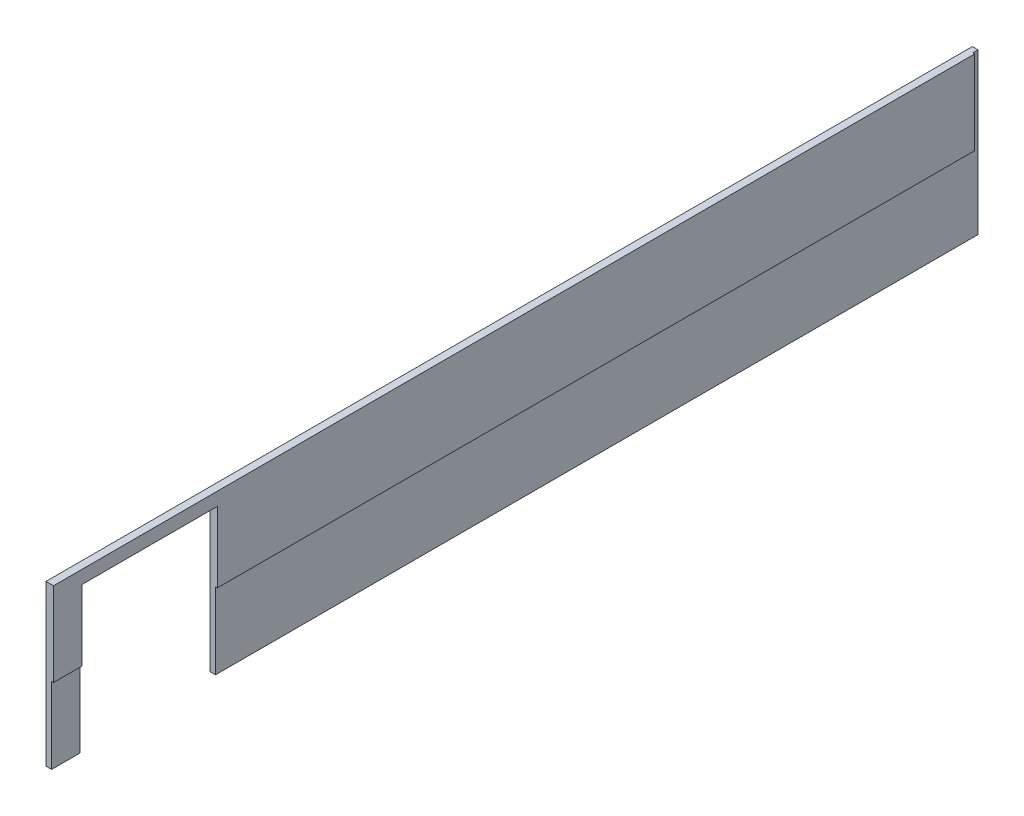
ISO-10303-21;
HEADER;
FILE_DESCRIPTION(('STEP AP214'),'2;1');
FILE_NAME('part.step','',(''),(''),'','','');
FILE_SCHEMA(('AUTOMOTIVE_DESIGN { 1 0 10303 214 1 1 1 1 }'));
ENDSEC;
DATA;
#1=APPLICATION_CONTEXT('core data for automotive mechanical design processes');
#2=APPLICATION_PROTOCOL_DEFINITION('international standard','automotive_design',2000,#1);
#3=PRODUCT_CONTEXT('',#1,'mechanical');
#4=PRODUCT('Part','Part','',(#3));
#5=PRODUCT_RELATED_PRODUCT_CATEGORY('part','',(#4));
#6=PRODUCT_DEFINITION_FORMATION('','',#4);
#7=PRODUCT_DEFINITION_CONTEXT('part definition',#1,'design');
#8=PRODUCT_DEFINITION('design','',#6,#7);
#9=PRODUCT_DEFINITION_SHAPE('','',#8);
#10=(LENGTH_UNIT() NAMED_UNIT(*) SI_UNIT(.MILLI.,.METRE.));
#11=(NAMED_UNIT(*) PLANE_ANGLE_UNIT() SI_UNIT($,.RADIAN.));
#12=(NAMED_UNIT(*) SI_UNIT($,.STERADIAN.) SOLID_ANGLE_UNIT());
#13=UNCERTAINTY_MEASURE_WITH_UNIT(LENGTH_MEASURE(1.E-05),#10,'distance_accuracy_value','');
#14=(GEOMETRIC_REPRESENTATION_CONTEXT(3) GLOBAL_UNCERTAINTY_ASSIGNED_CONTEXT((#13)) GLOBAL_UNIT_ASSIGNED_CONTEXT((#10,
#11,#12)) REPRESENTATION_CONTEXT('',''));
#15=CARTESIAN_POINT('',(0.,0.,0.));
#16=DIRECTION('',(0.,0.,1.));
#17=DIRECTION('',(1.,0.,0.));
#18=AXIS2_PLACEMENT_3D('',#15,#16,#17);
#19=CARTESIAN_POINT('',(76.2,0.,0.));
#20=DIRECTION('',(-1.,0.,0.));
#21=DIRECTION('',(0.,0.,1.));
#22=AXIS2_PLACEMENT_3D('',#19,#20,#21);
#23=PLANE('',#22);
#24=DIRECTION('',(0.,0.,-1.));
#25=VECTOR('',#24,1.);
#26=CARTESIAN_POINT('',(76.2,0.,0.));
#27=LINE('',#26,#25);
#28=CARTESIAN_POINT('',(76.2,0.,0.));
#29=VERTEX_POINT('',#28);
#30=CARTESIAN_POINT('',(76.2,0.,-381.));
#31=VERTEX_POINT('',#30);
#32=EDGE_CURVE('E185',#29,#31,#27,.T.);
#33=ORIENTED_EDGE('',*,*,#32,.T.);
#34=DIRECTION('',(0.,1.,0.));
#35=VECTOR('',#34,1.);
#36=CARTESIAN_POINT('',(76.2,0.,-381.));
#37=LINE('',#36,#35);
#38=CARTESIAN_POINT('',(76.2,1028.7,-381.));
#39=VERTEX_POINT('',#38);
#40=EDGE_CURVE('E169',#31,#39,#37,.T.);
#41=ORIENTED_EDGE('',*,*,#40,.T.);
#42=DIRECTION('',(0.,0.,-1.));
#43=VECTOR('',#42,1.);
#44=CARTESIAN_POINT('',(76.2,1028.7,0.));
#45=LINE('',#44,#43);
#46=CARTESIAN_POINT('',(76.2,1028.7,0.));
#47=VERTEX_POINT('',#46);
#48=EDGE_CURVE('E170',#47,#39,#45,.T.);
#49=ORIENTED_EDGE('',*,*,#48,.F.);
#50=DIRECTION('',(0.,-1.,0.));
#51=VECTOR('',#50,1.);
#52=CARTESIAN_POINT('',(76.2,0.,0.));
#53=LINE('',#52,#51);
#54=EDGE_CURVE('E181',#47,#29,#53,.T.);
#55=ORIENTED_EDGE('',*,*,#54,.T.);
#56=EDGE_LOOP('',(#33,#41,#49,#55));
#57=FACE_BOUND('',#56,.T.);
#58=ADVANCED_FACE('F35',(#57),#23,.F.);
#59=CARTESIAN_POINT('',(76.2,0.,0.));
#60=DIRECTION('',(0.,1.,0.));
#61=DIRECTION('',(0.,0.,1.));
#62=AXIS2_PLACEMENT_3D('',#59,#60,#61);
#63=PLANE('',#62);
#64=DIRECTION('',(0.,0.,-1.));
#65=VECTOR('',#64,1.);
#66=CARTESIAN_POINT('',(0.,0.,0.));
#67=LINE('',#66,#65);
#68=CARTESIAN_POINT('',(0.,0.,0.));
#69=VERTEX_POINT('',#68);
#70=CARTESIAN_POINT('',(0.,0.,-381.));
#71=VERTEX_POINT('',#70);
#72=EDGE_CURVE('E195',#69,#71,#67,.T.);
#73=ORIENTED_EDGE('',*,*,#72,.T.);
#74=DIRECTION('',(-1.,0.,0.));
#75=VECTOR('',#74,1.);
#76=CARTESIAN_POINT('',(101.6,0.,-381.));
#77=LINE('',#76,#75);
#78=EDGE_CURVE('E228',#31,#71,#77,.T.);
#79=ORIENTED_EDGE('',*,*,#78,.F.);
#80=ORIENTED_EDGE('',*,*,#32,.F.);
#81=DIRECTION('',(-1.,0.,0.));
#82=VECTOR('',#81,1.);
#83=CARTESIAN_POINT('',(76.2,0.,0.));
#84=LINE('',#83,#82);
#85=EDGE_CURVE('E43',#29,#69,#84,.T.);
#86=ORIENTED_EDGE('',*,*,#85,.T.);
#87=EDGE_LOOP('',(#73,#79,#80,#86));
#88=FACE_BOUND('',#87,.T.);
#89=ADVANCED_FACE('F212',(#88),#63,.F.);
#90=CARTESIAN_POINT('',(101.6,1028.7,0.));
#91=DIRECTION('',(0.,1.,0.));
#92=DIRECTION('',(0.,0.,1.));
#93=AXIS2_PLACEMENT_3D('',#90,#91,#92);
#94=PLANE('',#93);
#95=ORIENTED_EDGE('',*,*,#48,.T.);
#96=DIRECTION('',(1.,0.,0.));
#97=VECTOR('',#96,1.);
#98=CARTESIAN_POINT('',(101.6,1028.7,-381.));
#99=LINE('',#98,#97);
#100=CARTESIAN_POINT('',(101.6,1028.7,-381.));
#101=VERTEX_POINT('',#100);
#102=EDGE_CURVE('E240',#39,#101,#99,.T.);
#103=ORIENTED_EDGE('',*,*,#102,.T.);
#104=DIRECTION('',(0.,0.,-1.));
#105=VECTOR('',#104,1.);
#106=CARTESIAN_POINT('',(101.6,1028.7,0.));
#107=LINE('',#106,#105);
#108=CARTESIAN_POINT('',(101.6,1028.7,0.));
#109=VERTEX_POINT('',#108);
#110=EDGE_CURVE('E151',#109,#101,#107,.T.);
#111=ORIENTED_EDGE('',*,*,#110,.F.);
#112=DIRECTION('',(-1.,0.,0.));
#113=VECTOR('',#112,1.);
#114=CARTESIAN_POINT('',(101.6,1028.7,0.));
#115=LINE('',#114,#113);
#116=EDGE_CURVE('E174',#109,#47,#115,.T.);
#117=ORIENTED_EDGE('',*,*,#116,.T.);
#118=EDGE_LOOP('',(#95,#103,#111,#117));
#119=FACE_BOUND('',#118,.T.);
#120=ADVANCED_FACE('F268',(#119),#94,.F.);
#121=CARTESIAN_POINT('',(76.2,1028.7,-2209.8));
#122=VERTEX_POINT('',#121);
#123=CARTESIAN_POINT('',(76.2,1028.7,-12426.8750504237));
#124=VERTEX_POINT('',#123);
#125=EDGE_CURVE('E168',#122,#124,#45,.T.);
#126=ORIENTED_EDGE('',*,*,#125,.F.);
#127=DIRECTION('',(0.,-1.,0.));
#128=VECTOR('',#127,1.);
#129=CARTESIAN_POINT('',(76.2,0.,-2209.8));
#130=LINE('',#129,#128);
#131=CARTESIAN_POINT('',(76.2,-1.90130829823004E-13,-2209.8));
#132=VERTEX_POINT('',#131);
#133=EDGE_CURVE('E237',#122,#132,#130,.T.);
#134=ORIENTED_EDGE('',*,*,#133,.T.);
#135=CARTESIAN_POINT('',(76.2,0.,-12496.8));
#136=VERTEX_POINT('',#135);
#137=EDGE_CURVE('E183',#132,#136,#27,.T.);
#138=ORIENTED_EDGE('',*,*,#137,.T.);
#139=DIRECTION('',(0.,1.,0.));
#140=VECTOR('',#139,1.);
#141=CARTESIAN_POINT('',(76.2,0.,-12496.8));
#142=LINE('',#141,#140);
#143=CARTESIAN_POINT('',(76.2,2159.,-12496.8));
#144=VERTEX_POINT('',#143);
#145=EDGE_CURVE('E188',#136,#144,#142,.T.);
#146=ORIENTED_EDGE('',*,*,#145,.T.);
#147=DIRECTION('',(0.,0.,1.));
#148=VECTOR('',#147,1.);
#149=CARTESIAN_POINT('',(76.2,2159.,0.));
#150=LINE('',#149,#148);
#151=CARTESIAN_POINT('',(76.2,2159.,-12426.8750504237));
#152=VERTEX_POINT('',#151);
#153=EDGE_CURVE('E58',#144,#152,#150,.T.);
#154=ORIENTED_EDGE('',*,*,#153,.T.);
#155=DIRECTION('',(0.,1.,0.));
#156=VECTOR('',#155,1.);
#157=CARTESIAN_POINT('',(76.2,1028.7,-12426.8750504237));
#158=LINE('',#157,#156);
#159=EDGE_CURVE('E165',#124,#152,#158,.T.);
#160=ORIENTED_EDGE('',*,*,#159,.F.);
#161=EDGE_LOOP('',(#126,#134,#138,#146,#154,#160));
#162=FACE_BOUND('',#161,.T.);
#163=ADVANCED_FACE('F263',(#162),#23,.F.);
#164=CARTESIAN_POINT('',(76.2,0.,0.));
#165=DIRECTION('',(0.,0.,-1.));
#166=DIRECTION('',(-1.,0.,0.));
#167=AXIS2_PLACEMENT_3D('',#164,#165,#166);
#168=PLANE('',#167);
#169=DIRECTION('',(0.,-1.,0.));
#170=VECTOR('',#169,1.);
#171=CARTESIAN_POINT('',(0.,0.,0.));
#172=LINE('',#171,#170);
#173=CARTESIAN_POINT('',(0.,2159.,0.));
#174=VERTEX_POINT('',#173);
#175=EDGE_CURVE('E176',#174,#69,#172,.T.);
#176=ORIENTED_EDGE('',*,*,#175,.T.);
#177=ORIENTED_EDGE('',*,*,#85,.F.);
#178=ORIENTED_EDGE('',*,*,#54,.F.);
#179=ORIENTED_EDGE('',*,*,#116,.F.);
#180=DIRECTION('',(0.,1.,0.));
#181=VECTOR('',#180,1.);
#182=CARTESIAN_POINT('',(101.6,1028.7,0.));
#183=LINE('',#182,#181);
#184=CARTESIAN_POINT('',(101.6,2159.,0.));
#185=VERTEX_POINT('',#184);
#186=EDGE_CURVE('E154',#109,#185,#183,.T.);
#187=ORIENTED_EDGE('',*,*,#186,.T.);
#188=DIRECTION('',(-1.,0.,0.));
#189=VECTOR('',#188,1.);
#190=CARTESIAN_POINT('',(76.2,2159.,0.));
#191=LINE('',#190,#189);
#192=EDGE_CURVE('E191',#185,#174,#191,.T.);
#193=ORIENTED_EDGE('',*,*,#192,.T.);
#194=EDGE_LOOP('',(#176,#177,#178,#179,#187,#193));
#195=FACE_BOUND('',#194,.T.);
#196=ADVANCED_FACE('F37',(#195),#168,.F.);
#197=ORIENTED_EDGE('',*,*,#137,.F.);
#198=DIRECTION('',(-1.,0.,0.));
#199=VECTOR('',#198,1.);
#200=CARTESIAN_POINT('',(101.6,-1.90130829823004E-13,-2209.8));
#201=LINE('',#200,#199);
#202=CARTESIAN_POINT('',(0.,-1.90130829823004E-13,-2209.8));
#203=VERTEX_POINT('',#202);
#204=EDGE_CURVE('E231',#132,#203,#201,.T.);
#205=ORIENTED_EDGE('',*,*,#204,.T.);
#206=CARTESIAN_POINT('',(0.,0.,-12496.8));
#207=VERTEX_POINT('',#206);
#208=EDGE_CURVE('E194',#203,#207,#67,.T.);
#209=ORIENTED_EDGE('',*,*,#208,.T.);
#210=DIRECTION('',(-1.,0.,0.));
#211=VECTOR('',#210,1.);
#212=CARTESIAN_POINT('',(76.2,0.,-12496.8));
#213=LINE('',#212,#211);
#214=EDGE_CURVE('E206',#136,#207,#213,.T.);
#215=ORIENTED_EDGE('',*,*,#214,.F.);
#216=EDGE_LOOP('',(#197,#205,#209,#215));
#217=FACE_BOUND('',#216,.T.);
#218=ADVANCED_FACE('F260',(#217),#63,.F.);
#219=CARTESIAN_POINT('',(76.2,0.,-12496.8));
#220=DIRECTION('',(0.,0.,1.));
#221=DIRECTION('',(1.,0.,0.));
#222=AXIS2_PLACEMENT_3D('',#219,#220,#221);
#223=PLANE('',#222);
#224=DIRECTION('',(0.,1.,0.));
#225=VECTOR('',#224,1.);
#226=CARTESIAN_POINT('',(0.,0.,-12496.8));
#227=LINE('',#226,#225);
#228=CARTESIAN_POINT('',(0.,2159.,-12496.8));
#229=VERTEX_POINT('',#228);
#230=EDGE_CURVE('E198',#207,#229,#227,.T.);
#231=ORIENTED_EDGE('',*,*,#230,.T.);
#232=DIRECTION('',(-1.,0.,0.));
#233=VECTOR('',#232,1.);
#234=CARTESIAN_POINT('',(76.2,2159.,-12496.8));
#235=LINE('',#234,#233);
#236=EDGE_CURVE('E203',#144,#229,#235,.T.);
#237=ORIENTED_EDGE('',*,*,#236,.F.);
#238=ORIENTED_EDGE('',*,*,#145,.F.);
#239=ORIENTED_EDGE('',*,*,#214,.T.);
#240=EDGE_LOOP('',(#231,#237,#238,#239));
#241=FACE_BOUND('',#240,.T.);
#242=ADVANCED_FACE('F255',(#241),#223,.F.);
#243=CARTESIAN_POINT('',(76.2,2159.,0.));
#244=DIRECTION('',(0.,-1.,0.));
#245=DIRECTION('',(0.,0.,-1.));
#246=AXIS2_PLACEMENT_3D('',#243,#244,#245);
#247=PLANE('',#246);
#248=DIRECTION('',(0.,0.,1.));
#249=VECTOR('',#248,1.);
#250=CARTESIAN_POINT('',(0.,2159.,0.));
#251=LINE('',#250,#249);
#252=EDGE_CURVE('E184',#229,#174,#251,.T.);
#253=ORIENTED_EDGE('',*,*,#252,.T.);
#254=ORIENTED_EDGE('',*,*,#192,.F.);
#255=DIRECTION('',(0.,0.,-1.));
#256=VECTOR('',#255,1.);
#257=CARTESIAN_POINT('',(101.6,2159.,0.));
#258=LINE('',#257,#256);
#259=CARTESIAN_POINT('',(101.6,2159.,-12426.8750504237));
#260=VERTEX_POINT('',#259);
#261=EDGE_CURVE('E173',#185,#260,#258,.T.);
#262=ORIENTED_EDGE('',*,*,#261,.T.);
#263=DIRECTION('',(-1.,0.,0.));
#264=VECTOR('',#263,1.);
#265=CARTESIAN_POINT('',(101.6,2159.,-12426.8750504237));
#266=LINE('',#265,#264);
#267=EDGE_CURVE('E159',#260,#152,#266,.T.);
#268=ORIENTED_EDGE('',*,*,#267,.T.);
#269=ORIENTED_EDGE('',*,*,#153,.F.);
#270=ORIENTED_EDGE('',*,*,#236,.T.);
#271=EDGE_LOOP('',(#253,#254,#262,#268,#269,#270));
#272=FACE_BOUND('',#271,.T.);
#273=ADVANCED_FACE('F251',(#272),#247,.F.);
#274=CARTESIAN_POINT('',(0.,0.,0.));
#275=DIRECTION('',(-1.,0.,0.));
#276=DIRECTION('',(0.,0.,1.));
#277=AXIS2_PLACEMENT_3D('',#274,#275,#276);
#278=PLANE('',#277);
#279=DIRECTION('',(0.,1.,0.));
#280=VECTOR('',#279,1.);
#281=CARTESIAN_POINT('',(0.,0.,-381.));
#282=LINE('',#281,#280);
#283=CARTESIAN_POINT('',(0.,1981.2,-381.));
#284=VERTEX_POINT('',#283);
#285=EDGE_CURVE('E135',#71,#284,#282,.T.);
#286=ORIENTED_EDGE('',*,*,#285,.F.);
#287=ORIENTED_EDGE('',*,*,#72,.F.);
#288=ORIENTED_EDGE('',*,*,#175,.F.);
#289=ORIENTED_EDGE('',*,*,#252,.F.);
#290=ORIENTED_EDGE('',*,*,#230,.F.);
#291=ORIENTED_EDGE('',*,*,#208,.F.);
#292=DIRECTION('',(0.,-1.,0.));
#293=VECTOR('',#292,1.);
#294=CARTESIAN_POINT('',(0.,-1.90130829823004E-13,-2209.8));
#295=LINE('',#294,#293);
#296=CARTESIAN_POINT('',(0.,1981.2,-2209.8));
#297=VERTEX_POINT('',#296);
#298=EDGE_CURVE('E145',#297,#203,#295,.T.);
#299=ORIENTED_EDGE('',*,*,#298,.F.);
#300=DIRECTION('',(0.,0.,-1.));
#301=VECTOR('',#300,1.);
#302=CARTESIAN_POINT('',(0.,1981.2,-381.));
#303=LINE('',#302,#301);
#304=EDGE_CURVE('E222',#284,#297,#303,.T.);
#305=ORIENTED_EDGE('',*,*,#304,.F.);
#306=EDGE_LOOP('',(#286,#287,#288,#289,#290,#291,#299,#305));
#307=FACE_BOUND('',#306,.T.);
#308=ADVANCED_FACE('F219',(#307),#278,.T.);
#309=CARTESIAN_POINT('',(101.6,1028.7,-2209.8));
#310=VERTEX_POINT('',#309);
#311=CARTESIAN_POINT('',(101.6,1028.7,-12426.8750504237));
#312=VERTEX_POINT('',#311);
#313=EDGE_CURVE('E157',#310,#312,#107,.T.);
#314=ORIENTED_EDGE('',*,*,#313,.F.);
#315=DIRECTION('',(-1.,0.,0.));
#316=VECTOR('',#315,1.);
#317=CARTESIAN_POINT('',(101.6,1028.7,-2209.8));
#318=LINE('',#317,#316);
#319=EDGE_CURVE('E230',#310,#122,#318,.T.);
#320=ORIENTED_EDGE('',*,*,#319,.T.);
#321=ORIENTED_EDGE('',*,*,#125,.T.);
#322=DIRECTION('',(-1.,0.,0.));
#323=VECTOR('',#322,1.);
#324=CARTESIAN_POINT('',(101.6,1028.7,-12426.8750504237));
#325=LINE('',#324,#323);
#326=EDGE_CURVE('E177',#312,#124,#325,.T.);
#327=ORIENTED_EDGE('',*,*,#326,.F.);
#328=EDGE_LOOP('',(#314,#320,#321,#327));
#329=FACE_BOUND('',#328,.T.);
#330=ADVANCED_FACE('F265',(#329),#94,.F.);
#331=CARTESIAN_POINT('',(101.6,1028.7,-12426.8750504237));
#332=DIRECTION('',(0.,0.,1.));
#333=DIRECTION('',(1.,0.,0.));
#334=AXIS2_PLACEMENT_3D('',#331,#332,#333);
#335=PLANE('',#334);
#336=ORIENTED_EDGE('',*,*,#159,.T.);
#337=ORIENTED_EDGE('',*,*,#267,.F.);
#338=DIRECTION('',(0.,1.,0.));
#339=VECTOR('',#338,1.);
#340=CARTESIAN_POINT('',(101.6,1028.7,-12426.8750504237));
#341=LINE('',#340,#339);
#342=EDGE_CURVE('E161',#312,#260,#341,.T.);
#343=ORIENTED_EDGE('',*,*,#342,.F.);
#344=ORIENTED_EDGE('',*,*,#326,.T.);
#345=EDGE_LOOP('',(#336,#337,#343,#344));
#346=FACE_BOUND('',#345,.T.);
#347=ADVANCED_FACE('F250',(#346),#335,.F.);
#348=CARTESIAN_POINT('',(101.6,0.,0.));
#349=DIRECTION('',(1.,0.,0.));
#350=DIRECTION('',(0.,0.,-1.));
#351=AXIS2_PLACEMENT_3D('',#348,#349,#350);
#352=PLANE('',#351);
#353=DIRECTION('',(0.,-1.,0.));
#354=VECTOR('',#353,1.);
#355=CARTESIAN_POINT('',(101.6,0.,-381.));
#356=LINE('',#355,#354);
#357=CARTESIAN_POINT('',(101.6,1981.2,-381.));
#358=VERTEX_POINT('',#357);
#359=EDGE_CURVE('E11',#358,#101,#356,.T.);
#360=ORIENTED_EDGE('',*,*,#359,.F.);
#361=DIRECTION('',(0.,0.,-1.));
#362=VECTOR('',#361,1.);
#363=CARTESIAN_POINT('',(101.6,1981.2,-381.));
#364=LINE('',#363,#362);
#365=CARTESIAN_POINT('',(101.6,1981.2,-2209.8));
#366=VERTEX_POINT('',#365);
#367=EDGE_CURVE('E142',#358,#366,#364,.T.);
#368=ORIENTED_EDGE('',*,*,#367,.T.);
#369=DIRECTION('',(0.,-1.,0.));
#370=VECTOR('',#369,1.);
#371=CARTESIAN_POINT('',(101.6,-1.90130829823004E-13,-2209.8));
#372=LINE('',#371,#370);
#373=EDGE_CURVE('E50',#366,#310,#372,.T.);
#374=ORIENTED_EDGE('',*,*,#373,.T.);
#375=ORIENTED_EDGE('',*,*,#313,.T.);
#376=ORIENTED_EDGE('',*,*,#342,.T.);
#377=ORIENTED_EDGE('',*,*,#261,.F.);
#378=ORIENTED_EDGE('',*,*,#186,.F.);
#379=ORIENTED_EDGE('',*,*,#110,.T.);
#380=EDGE_LOOP('',(#360,#368,#374,#375,#376,#377,#378,#379));
#381=FACE_BOUND('',#380,.T.);
#382=ADVANCED_FACE('F148',(#381),#352,.T.);
#383=CARTESIAN_POINT('',(101.6,0.,-381.));
#384=DIRECTION('',(0.,0.,1.));
#385=DIRECTION('',(1.,0.,0.));
#386=AXIS2_PLACEMENT_3D('',#383,#384,#385);
#387=PLANE('',#386);
#388=ORIENTED_EDGE('',*,*,#78,.T.);
#389=ORIENTED_EDGE('',*,*,#285,.T.);
#390=DIRECTION('',(-1.,0.,0.));
#391=VECTOR('',#390,1.);
#392=CARTESIAN_POINT('',(101.6,1981.2,-381.));
#393=LINE('',#392,#391);
#394=EDGE_CURVE('E129',#358,#284,#393,.T.);
#395=ORIENTED_EDGE('',*,*,#394,.F.);
#396=ORIENTED_EDGE('',*,*,#359,.T.);
#397=ORIENTED_EDGE('',*,*,#102,.F.);
#398=ORIENTED_EDGE('',*,*,#40,.F.);
#399=EDGE_LOOP('',(#388,#389,#395,#396,#397,#398));
#400=FACE_BOUND('',#399,.T.);
#401=ADVANCED_FACE('F131',(#400),#387,.F.);
#402=CARTESIAN_POINT('',(101.6,-1.90130829823004E-13,-2209.8));
#403=DIRECTION('',(0.,0.,-1.));
#404=DIRECTION('',(-1.,0.,0.));
#405=AXIS2_PLACEMENT_3D('',#402,#403,#404);
#406=PLANE('',#405);
#407=ORIENTED_EDGE('',*,*,#319,.F.);
#408=ORIENTED_EDGE('',*,*,#373,.F.);
#409=DIRECTION('',(-1.,0.,0.));
#410=VECTOR('',#409,1.);
#411=CARTESIAN_POINT('',(101.6,1981.2,-2209.8));
#412=LINE('',#411,#410);
#413=EDGE_CURVE('E139',#366,#297,#412,.T.);
#414=ORIENTED_EDGE('',*,*,#413,.T.);
#415=ORIENTED_EDGE('',*,*,#298,.T.);
#416=ORIENTED_EDGE('',*,*,#204,.F.);
#417=ORIENTED_EDGE('',*,*,#133,.F.);
#418=EDGE_LOOP('',(#407,#408,#414,#415,#416,#417));
#419=FACE_BOUND('',#418,.T.);
#420=ADVANCED_FACE('F261',(#419),#406,.F.);
#421=CARTESIAN_POINT('',(101.6,1981.2,-381.));
#422=DIRECTION('',(0.,1.,0.));
#423=DIRECTION('',(0.,0.,1.));
#424=AXIS2_PLACEMENT_3D('',#421,#422,#423);
#425=PLANE('',#424);
#426=ORIENTED_EDGE('',*,*,#304,.T.);
#427=ORIENTED_EDGE('',*,*,#413,.F.);
#428=ORIENTED_EDGE('',*,*,#367,.F.);
#429=ORIENTED_EDGE('',*,*,#394,.T.);
#430=EDGE_LOOP('',(#426,#427,#428,#429));
#431=FACE_BOUND('',#430,.T.);
#432=ADVANCED_FACE('F143',(#431),#425,.F.);
#433=CLOSED_SHELL('',(#58,#89,#120,#163,#196,#218,#242,#273,#308,#330,#347,#382,#401,#420,#432));
#434=MANIFOLD_SOLID_BREP('B2',#433);
#435=ADVANCED_BREP_SHAPE_REPRESENTATION('',(#18,#434),#14);
#436=SHAPE_DEFINITION_REPRESENTATION(#9,#435);
ENDSEC;
END-ISO-10303-21;
